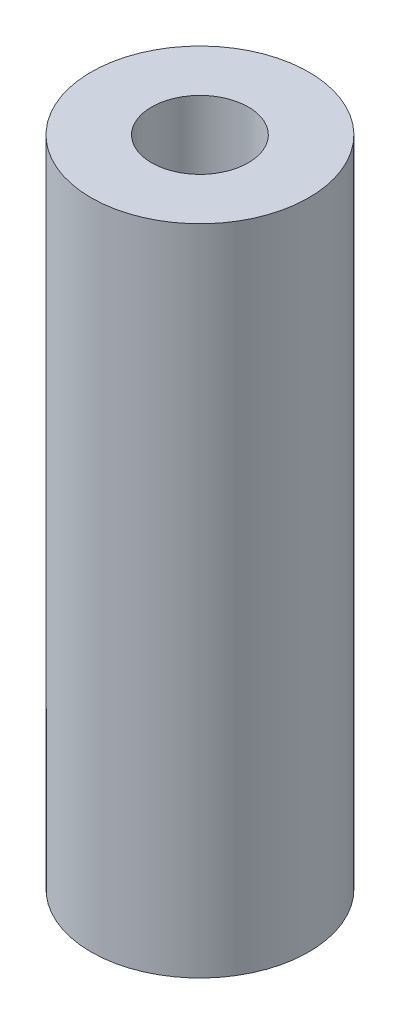
ISO-10303-21;
HEADER;
FILE_DESCRIPTION(('STEP AP214'),'2;1');
FILE_NAME('part.step','',(''),(''),'','','');
FILE_SCHEMA(('AUTOMOTIVE_DESIGN { 1 0 10303 214 1 1 1 1 }'));
ENDSEC;
DATA;
#1=APPLICATION_CONTEXT('core data for automotive mechanical design processes');
#2=APPLICATION_PROTOCOL_DEFINITION('international standard','automotive_design',2000,#1);
#3=PRODUCT_CONTEXT('',#1,'mechanical');
#4=PRODUCT('Part','Part','',(#3));
#5=PRODUCT_RELATED_PRODUCT_CATEGORY('part','',(#4));
#6=PRODUCT_DEFINITION_FORMATION('','',#4);
#7=PRODUCT_DEFINITION_CONTEXT('part definition',#1,'design');
#8=PRODUCT_DEFINITION('design','',#6,#7);
#9=PRODUCT_DEFINITION_SHAPE('','',#8);
#10=(LENGTH_UNIT() NAMED_UNIT(*) SI_UNIT(.MILLI.,.METRE.));
#11=(NAMED_UNIT(*) PLANE_ANGLE_UNIT() SI_UNIT($,.RADIAN.));
#12=(NAMED_UNIT(*) SI_UNIT($,.STERADIAN.) SOLID_ANGLE_UNIT());
#13=UNCERTAINTY_MEASURE_WITH_UNIT(LENGTH_MEASURE(1.E-05),#10,'distance_accuracy_value','');
#14=(GEOMETRIC_REPRESENTATION_CONTEXT(3) GLOBAL_UNCERTAINTY_ASSIGNED_CONTEXT((#13)) GLOBAL_UNIT_ASSIGNED_CONTEXT((#10,
#11,#12)) REPRESENTATION_CONTEXT('',''));
#15=CARTESIAN_POINT('',(0.,0.,0.));
#16=DIRECTION('',(0.,0.,1.));
#17=DIRECTION('',(1.,0.,0.));
#18=AXIS2_PLACEMENT_3D('',#15,#16,#17);
#19=CARTESIAN_POINT('',(0.,27.,0.));
#20=DIRECTION('',(0.,1.,0.));
#21=DIRECTION('',(0.,0.,1.));
#22=AXIS2_PLACEMENT_3D('',#19,#20,#21);
#23=PLANE('',#22);
#24=CARTESIAN_POINT('',(0.,27.,0.));
#25=DIRECTION('',(0.,1.,0.));
#26=DIRECTION('',(0.,0.,1.));
#27=AXIS2_PLACEMENT_3D('',#24,#25,#26);
#28=CIRCLE('',#27,4.5);
#29=CARTESIAN_POINT('',(0.,27.,4.5));
#30=VERTEX_POINT('',#29);
#31=EDGE_CURVE('E10',#30,#30,#28,.T.);
#32=ORIENTED_EDGE('',*,*,#31,.T.);
#33=EDGE_LOOP('',(#32));
#34=FACE_BOUND('',#33,.T.);
#35=CARTESIAN_POINT('',(0.,27.,0.));
#36=DIRECTION('',(0.,1.,0.));
#37=DIRECTION('',(0.,0.,1.));
#38=AXIS2_PLACEMENT_3D('',#35,#36,#37);
#39=CIRCLE('',#38,2.);
#40=CARTESIAN_POINT('',(0.,27.,2.));
#41=VERTEX_POINT('',#40);
#42=EDGE_CURVE('E42',#41,#41,#39,.T.);
#43=ORIENTED_EDGE('',*,*,#42,.F.);
#44=EDGE_LOOP('',(#43));
#45=FACE_BOUND('',#44,.T.);
#46=ADVANCED_FACE('F31',(#34,#45),#23,.T.);
#47=CARTESIAN_POINT('',(0.,0.,0.));
#48=DIRECTION('',(0.,1.,0.));
#49=DIRECTION('',(0.,0.,1.));
#50=AXIS2_PLACEMENT_3D('',#47,#48,#49);
#51=PLANE('',#50);
#52=CARTESIAN_POINT('',(0.,0.,0.));
#53=DIRECTION('',(0.,1.,0.));
#54=DIRECTION('',(0.,0.,1.));
#55=AXIS2_PLACEMENT_3D('',#52,#53,#54);
#56=CIRCLE('',#55,4.5);
#57=CARTESIAN_POINT('',(0.,0.,4.5));
#58=VERTEX_POINT('',#57);
#59=EDGE_CURVE('E35',#58,#58,#56,.T.);
#60=ORIENTED_EDGE('',*,*,#59,.F.);
#61=EDGE_LOOP('',(#60));
#62=FACE_BOUND('',#61,.T.);
#63=CARTESIAN_POINT('',(0.,0.,0.));
#64=DIRECTION('',(0.,1.,0.));
#65=DIRECTION('',(0.,0.,1.));
#66=AXIS2_PLACEMENT_3D('',#63,#64,#65);
#67=CIRCLE('',#66,2.);
#68=CARTESIAN_POINT('',(0.,0.,2.));
#69=VERTEX_POINT('',#68);
#70=EDGE_CURVE('E44',#69,#69,#67,.T.);
#71=ORIENTED_EDGE('',*,*,#70,.T.);
#72=EDGE_LOOP('',(#71));
#73=FACE_BOUND('',#72,.T.);
#74=ADVANCED_FACE('F54',(#62,#73),#51,.F.);
#75=CARTESIAN_POINT('',(0.,27.,0.));
#76=DIRECTION('',(0.,-1.,0.));
#77=DIRECTION('',(0.,0.,-1.));
#78=AXIS2_PLACEMENT_3D('',#75,#76,#77);
#79=CYLINDRICAL_SURFACE('',#78,4.5);
#80=ORIENTED_EDGE('',*,*,#31,.F.);
#81=EDGE_LOOP('',(#80));
#82=FACE_BOUND('',#81,.T.);
#83=ORIENTED_EDGE('',*,*,#59,.T.);
#84=EDGE_LOOP('',(#83));
#85=FACE_BOUND('',#84,.T.);
#86=ADVANCED_FACE('F33',(#82,#85),#79,.T.);
#87=CARTESIAN_POINT('',(0.,27.,0.));
#88=DIRECTION('',(0.,-1.,0.));
#89=DIRECTION('',(0.,0.,-1.));
#90=AXIS2_PLACEMENT_3D('',#87,#88,#89);
#91=CYLINDRICAL_SURFACE('',#90,2.);
#92=ORIENTED_EDGE('',*,*,#42,.T.);
#93=EDGE_LOOP('',(#92));
#94=FACE_BOUND('',#93,.T.);
#95=ORIENTED_EDGE('',*,*,#70,.F.);
#96=EDGE_LOOP('',(#95));
#97=FACE_BOUND('',#96,.T.);
#98=ADVANCED_FACE('F50',(#94,#97),#91,.F.);
#99=CLOSED_SHELL('',(#46,#74,#86,#98));
#100=MANIFOLD_SOLID_BREP('B2',#99);
#101=ADVANCED_BREP_SHAPE_REPRESENTATION('',(#18,#100),#14);
#102=SHAPE_DEFINITION_REPRESENTATION(#9,#101);
ENDSEC;
END-ISO-10303-21;
